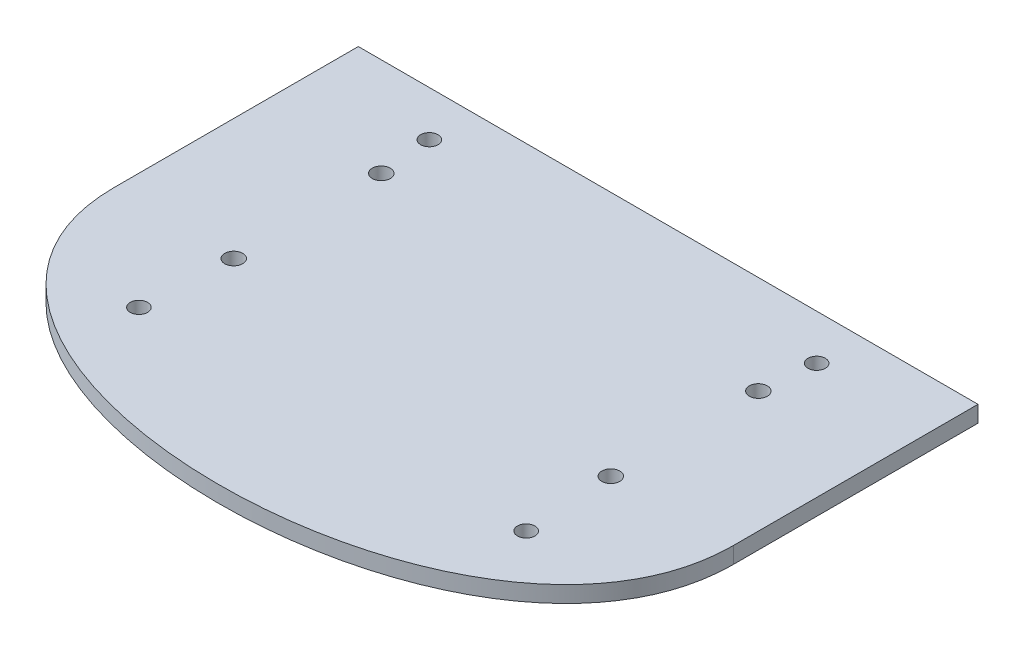
ISO-10303-21;
HEADER;
FILE_DESCRIPTION(('STEP AP214'),'2;1');
FILE_NAME('part.step','',(''),(''),'','','');
FILE_SCHEMA(('AUTOMOTIVE_DESIGN { 1 0 10303 214 1 1 1 1 }'));
ENDSEC;
DATA;
#1=APPLICATION_CONTEXT('core data for automotive mechanical design processes');
#2=APPLICATION_PROTOCOL_DEFINITION('international standard','automotive_design',2000,#1);
#3=PRODUCT_CONTEXT('',#1,'mechanical');
#4=PRODUCT('Part','Part','',(#3));
#5=PRODUCT_RELATED_PRODUCT_CATEGORY('part','',(#4));
#6=PRODUCT_DEFINITION_FORMATION('','',#4);
#7=PRODUCT_DEFINITION_CONTEXT('part definition',#1,'design');
#8=PRODUCT_DEFINITION('design','',#6,#7);
#9=PRODUCT_DEFINITION_SHAPE('','',#8);
#10=(LENGTH_UNIT() NAMED_UNIT(*) SI_UNIT(.MILLI.,.METRE.));
#11=(NAMED_UNIT(*) PLANE_ANGLE_UNIT() SI_UNIT($,.RADIAN.));
#12=(NAMED_UNIT(*) SI_UNIT($,.STERADIAN.) SOLID_ANGLE_UNIT());
#13=UNCERTAINTY_MEASURE_WITH_UNIT(LENGTH_MEASURE(1.E-05),#10,'distance_accuracy_value','');
#14=(GEOMETRIC_REPRESENTATION_CONTEXT(3) GLOBAL_UNCERTAINTY_ASSIGNED_CONTEXT((#13)) GLOBAL_UNIT_ASSIGNED_CONTEXT((#10,
#11,#12)) REPRESENTATION_CONTEXT('',''));
#15=CARTESIAN_POINT('',(0.,0.,0.));
#16=DIRECTION('',(0.,0.,1.));
#17=DIRECTION('',(1.,0.,0.));
#18=AXIS2_PLACEMENT_3D('',#15,#16,#17);
#19=CARTESIAN_POINT('',(-48.006,2.54,-34.798));
#20=DIRECTION('',(1.,0.,0.));
#21=DIRECTION('',(0.,0.,-1.));
#22=AXIS2_PLACEMENT_3D('',#19,#20,#21);
#23=PLANE('',#22);
#24=DIRECTION('',(0.,0.,1.));
#25=VECTOR('',#24,1.);
#26=CARTESIAN_POINT('',(-48.006,0.,-34.798));
#27=LINE('',#26,#25);
#28=CARTESIAN_POINT('',(-48.006,0.,-34.798));
#29=VERTEX_POINT('',#28);
#30=CARTESIAN_POINT('',(-48.006,0.,3.04800000000002));
#31=VERTEX_POINT('',#30);
#32=EDGE_CURVE('E98',#29,#31,#27,.T.);
#33=ORIENTED_EDGE('',*,*,#32,.T.);
#34=DIRECTION('',(0.,-1.,0.));
#35=VECTOR('',#34,1.);
#36=CARTESIAN_POINT('',(-48.006,2.54,3.04800000000002));
#37=LINE('',#36,#35);
#38=CARTESIAN_POINT('',(-48.006,2.54,3.04800000000002));
#39=VERTEX_POINT('',#38);
#40=EDGE_CURVE('E11',#39,#31,#37,.T.);
#41=ORIENTED_EDGE('',*,*,#40,.F.);
#42=DIRECTION('',(0.,0.,1.));
#43=VECTOR('',#42,1.);
#44=CARTESIAN_POINT('',(-48.006,2.54,-34.798));
#45=LINE('',#44,#43);
#46=CARTESIAN_POINT('',(-48.006,2.54,-34.798));
#47=VERTEX_POINT('',#46);
#48=EDGE_CURVE('E83',#47,#39,#45,.T.);
#49=ORIENTED_EDGE('',*,*,#48,.F.);
#50=DIRECTION('',(0.,-1.,0.));
#51=VECTOR('',#50,1.);
#52=CARTESIAN_POINT('',(-48.006,2.54,-34.798));
#53=LINE('',#52,#51);
#54=EDGE_CURVE('E91',#47,#29,#53,.T.);
#55=ORIENTED_EDGE('',*,*,#54,.T.);
#56=EDGE_LOOP('',(#33,#41,#49,#55));
#57=FACE_BOUND('',#56,.T.);
#58=ADVANCED_FACE('F32',(#57),#23,.F.);
#59=CARTESIAN_POINT('',(-48.006,2.54,3.04800000000002));
#60=CARTESIAN_POINT('',(-48.006,2.54,45.3813333333333));
#61=CARTESIAN_POINT('',(48.0060000000003,2.54,45.3813333333333));
#62=CARTESIAN_POINT('',(48.006,2.54,3.04800000000002));
#63=B_SPLINE_CURVE_WITH_KNOTS('',3,(#59,#60,#61,#62),.UNSPECIFIED.,.F.,.F.,(4,4),(0.,1.),.UNSPECIFIED.);
#64=DIRECTION('',(0.,-1.,0.));
#65=VECTOR('',#64,1.);
#66=SURFACE_OF_LINEAR_EXTRUSION('',#63,#65);
#67=CARTESIAN_POINT('',(-48.006,0.,3.04800000000002));
#68=CARTESIAN_POINT('',(-48.006,0.,45.3813333333333));
#69=CARTESIAN_POINT('',(48.0060000000003,0.,45.3813333333333));
#70=CARTESIAN_POINT('',(48.006,0.,3.04800000000002));
#71=B_SPLINE_CURVE_WITH_KNOTS('',3,(#67,#68,#69,#70),.UNSPECIFIED.,.F.,.F.,(4,4),(0.,1.),.UNSPECIFIED.);
#72=CARTESIAN_POINT('',(48.006,0.,3.04800000000001));
#73=VERTEX_POINT('',#72);
#74=EDGE_CURVE('E87',#31,#73,#71,.T.);
#75=ORIENTED_EDGE('',*,*,#74,.T.);
#76=DIRECTION('',(0.,-1.,0.));
#77=VECTOR('',#76,1.);
#78=CARTESIAN_POINT('',(48.006,2.54,3.04800000000001));
#79=LINE('',#78,#77);
#80=CARTESIAN_POINT('',(48.006,2.54,3.04800000000001));
#81=VERTEX_POINT('',#80);
#82=EDGE_CURVE('E40',#81,#73,#79,.T.);
#83=ORIENTED_EDGE('',*,*,#82,.F.);
#84=EDGE_CURVE('E78',#39,#81,#63,.T.);
#85=ORIENTED_EDGE('',*,*,#84,.F.);
#86=ORIENTED_EDGE('',*,*,#40,.T.);
#87=EDGE_LOOP('',(#75,#83,#85,#86));
#88=FACE_BOUND('',#87,.T.);
#89=ADVANCED_FACE('F86',(#88),#66,.F.);
#90=CARTESIAN_POINT('',(48.006,2.54,-34.798));
#91=DIRECTION('',(-1.,0.,0.));
#92=DIRECTION('',(0.,0.,1.));
#93=AXIS2_PLACEMENT_3D('',#90,#91,#92);
#94=PLANE('',#93);
#95=DIRECTION('',(0.,0.,-1.));
#96=VECTOR('',#95,1.);
#97=CARTESIAN_POINT('',(48.006,0.,-34.798));
#98=LINE('',#97,#96);
#99=CARTESIAN_POINT('',(48.006,0.,-34.798));
#100=VERTEX_POINT('',#99);
#101=EDGE_CURVE('E65',#73,#100,#98,.T.);
#102=ORIENTED_EDGE('',*,*,#101,.T.);
#103=DIRECTION('',(0.,-1.,0.));
#104=VECTOR('',#103,1.);
#105=CARTESIAN_POINT('',(48.006,2.54,-34.798));
#106=LINE('',#105,#104);
#107=CARTESIAN_POINT('',(48.006,2.54,-34.798));
#108=VERTEX_POINT('',#107);
#109=EDGE_CURVE('E88',#108,#100,#106,.T.);
#110=ORIENTED_EDGE('',*,*,#109,.F.);
#111=DIRECTION('',(0.,0.,-1.));
#112=VECTOR('',#111,1.);
#113=CARTESIAN_POINT('',(48.006,2.54,-34.798));
#114=LINE('',#113,#112);
#115=EDGE_CURVE('E81',#81,#108,#114,.T.);
#116=ORIENTED_EDGE('',*,*,#115,.F.);
#117=ORIENTED_EDGE('',*,*,#82,.T.);
#118=EDGE_LOOP('',(#102,#110,#116,#117));
#119=FACE_BOUND('',#118,.T.);
#120=ADVANCED_FACE('F89',(#119),#94,.F.);
#121=CARTESIAN_POINT('',(48.006,2.54,-34.798));
#122=DIRECTION('',(0.,0.,1.));
#123=DIRECTION('',(1.,0.,0.));
#124=AXIS2_PLACEMENT_3D('',#121,#122,#123);
#125=PLANE('',#124);
#126=DIRECTION('',(-1.,0.,0.));
#127=VECTOR('',#126,1.);
#128=CARTESIAN_POINT('',(48.006,0.,-34.798));
#129=LINE('',#128,#127);
#130=EDGE_CURVE('E71',#100,#29,#129,.T.);
#131=ORIENTED_EDGE('',*,*,#130,.T.);
#132=ORIENTED_EDGE('',*,*,#54,.F.);
#133=DIRECTION('',(-1.,0.,0.));
#134=VECTOR('',#133,1.);
#135=CARTESIAN_POINT('',(48.006,2.54,-34.798));
#136=LINE('',#135,#134);
#137=EDGE_CURVE('E48',#108,#47,#136,.T.);
#138=ORIENTED_EDGE('',*,*,#137,.F.);
#139=ORIENTED_EDGE('',*,*,#109,.T.);
#140=EDGE_LOOP('',(#131,#132,#138,#139));
#141=FACE_BOUND('',#140,.T.);
#142=ADVANCED_FACE('F111',(#141),#125,.F.);
#143=CARTESIAN_POINT('',(1.21430643318376E-13,2.54,34.798));
#144=DIRECTION('',(0.,-1.,0.));
#145=DIRECTION('',(0.,0.,-1.));
#146=AXIS2_PLACEMENT_3D('',#143,#144,#145);
#147=PLANE('',#146);
#148=CARTESIAN_POINT('',(-29.21,2.54,3.30199999999999));
#149=DIRECTION('',(0.,-1.,0.));
#150=DIRECTION('',(0.,0.,-1.));
#151=AXIS2_PLACEMENT_3D('',#148,#149,#150);
#152=CIRCLE('',#151,1.397);
#153=CARTESIAN_POINT('',(-29.21,2.54,1.90499999999999));
#154=VERTEX_POINT('',#153);
#155=EDGE_CURVE('E101',#154,#154,#152,.T.);
#156=ORIENTED_EDGE('',*,*,#155,.T.);
#157=EDGE_LOOP('',(#156));
#158=FACE_BOUND('',#157,.T.);
#159=CARTESIAN_POINT('',(29.21,2.54,3.30199999999999));
#160=DIRECTION('',(0.,-1.,0.));
#161=DIRECTION('',(0.,0.,-1.));
#162=AXIS2_PLACEMENT_3D('',#159,#160,#161);
#163=CIRCLE('',#162,1.397);
#164=CARTESIAN_POINT('',(29.21,2.54,1.90499999999999));
#165=VERTEX_POINT('',#164);
#166=EDGE_CURVE('E119',#165,#165,#163,.T.);
#167=ORIENTED_EDGE('',*,*,#166,.T.);
#168=EDGE_LOOP('',(#167));
#169=FACE_BOUND('',#168,.T.);
#170=CARTESIAN_POINT('',(29.21,2.54,-19.558));
#171=DIRECTION('',(0.,-1.,0.));
#172=DIRECTION('',(0.,0.,-1.));
#173=AXIS2_PLACEMENT_3D('',#170,#171,#172);
#174=CIRCLE('',#173,1.397);
#175=CARTESIAN_POINT('',(29.21,2.54,-20.955));
#176=VERTEX_POINT('',#175);
#177=EDGE_CURVE('E122',#176,#176,#174,.T.);
#178=ORIENTED_EDGE('',*,*,#177,.T.);
#179=EDGE_LOOP('',(#178));
#180=FACE_BOUND('',#179,.T.);
#181=CARTESIAN_POINT('',(-30.,2.54,-27.798));
#182=DIRECTION('',(0.,-1.,0.));
#183=DIRECTION('',(0.,0.,-1.));
#184=AXIS2_PLACEMENT_3D('',#181,#182,#183);
#185=CIRCLE('',#184,1.35);
#186=CARTESIAN_POINT('',(-30.,2.54,-29.148));
#187=VERTEX_POINT('',#186);
#188=EDGE_CURVE('E125',#187,#187,#185,.T.);
#189=ORIENTED_EDGE('',*,*,#188,.T.);
#190=EDGE_LOOP('',(#189));
#191=FACE_BOUND('',#190,.T.);
#192=CARTESIAN_POINT('',(-30.,2.54,17.202));
#193=DIRECTION('',(0.,-1.,0.));
#194=DIRECTION('',(0.,0.,-1.));
#195=AXIS2_PLACEMENT_3D('',#192,#193,#194);
#196=CIRCLE('',#195,1.35000000000001);
#197=CARTESIAN_POINT('',(-30.,2.54,15.852));
#198=VERTEX_POINT('',#197);
#199=EDGE_CURVE('E128',#198,#198,#196,.T.);
#200=ORIENTED_EDGE('',*,*,#199,.T.);
#201=EDGE_LOOP('',(#200));
#202=FACE_BOUND('',#201,.T.);
#203=CARTESIAN_POINT('',(30.,2.54,17.202));
#204=DIRECTION('',(0.,-1.,0.));
#205=DIRECTION('',(0.,0.,-1.));
#206=AXIS2_PLACEMENT_3D('',#203,#204,#205);
#207=CIRCLE('',#206,1.35000000000001);
#208=CARTESIAN_POINT('',(30.,2.54,15.852));
#209=VERTEX_POINT('',#208);
#210=EDGE_CURVE('E131',#209,#209,#207,.T.);
#211=ORIENTED_EDGE('',*,*,#210,.T.);
#212=EDGE_LOOP('',(#211));
#213=FACE_BOUND('',#212,.T.);
#214=CARTESIAN_POINT('',(30.,2.54,-27.798));
#215=DIRECTION('',(0.,-1.,0.));
#216=DIRECTION('',(0.,0.,-1.));
#217=AXIS2_PLACEMENT_3D('',#214,#215,#216);
#218=CIRCLE('',#217,1.35);
#219=CARTESIAN_POINT('',(30.,2.54,-29.148));
#220=VERTEX_POINT('',#219);
#221=EDGE_CURVE('E134',#220,#220,#218,.T.);
#222=ORIENTED_EDGE('',*,*,#221,.T.);
#223=EDGE_LOOP('',(#222));
#224=FACE_BOUND('',#223,.T.);
#225=CARTESIAN_POINT('',(-29.21,2.54,-19.558));
#226=DIRECTION('',(0.,-1.,0.));
#227=DIRECTION('',(0.,0.,-1.));
#228=AXIS2_PLACEMENT_3D('',#225,#226,#227);
#229=CIRCLE('',#228,1.397);
#230=CARTESIAN_POINT('',(-29.21,2.54,-20.955));
#231=VERTEX_POINT('',#230);
#232=EDGE_CURVE('E137',#231,#231,#229,.T.);
#233=ORIENTED_EDGE('',*,*,#232,.T.);
#234=EDGE_LOOP('',(#233));
#235=FACE_BOUND('',#234,.T.);
#236=ORIENTED_EDGE('',*,*,#48,.T.);
#237=ORIENTED_EDGE('',*,*,#84,.T.);
#238=ORIENTED_EDGE('',*,*,#115,.T.);
#239=ORIENTED_EDGE('',*,*,#137,.T.);
#240=EDGE_LOOP('',(#236,#237,#238,#239));
#241=FACE_BOUND('',#240,.T.);
#242=ADVANCED_FACE('F79',(#158,#169,#180,#191,#202,#213,#224,#235,#241),#147,.F.);
#243=CARTESIAN_POINT('',(1.21430643318376E-13,0.,34.798));
#244=DIRECTION('',(0.,-1.,0.));
#245=DIRECTION('',(0.,0.,-1.));
#246=AXIS2_PLACEMENT_3D('',#243,#244,#245);
#247=PLANE('',#246);
#248=CARTESIAN_POINT('',(-29.21,0.,3.30199999999999));
#249=DIRECTION('',(0.,1.,0.));
#250=DIRECTION('',(0.,0.,1.));
#251=AXIS2_PLACEMENT_3D('',#248,#249,#250);
#252=CIRCLE('',#251,1.397);
#253=CARTESIAN_POINT('',(-29.21,0.,4.69899999999999));
#254=VERTEX_POINT('',#253);
#255=EDGE_CURVE('E143',#254,#254,#252,.T.);
#256=ORIENTED_EDGE('',*,*,#255,.T.);
#257=EDGE_LOOP('',(#256));
#258=FACE_BOUND('',#257,.T.);
#259=CARTESIAN_POINT('',(29.21,0.,3.30199999999999));
#260=DIRECTION('',(0.,1.,0.));
#261=DIRECTION('',(0.,0.,-1.));
#262=AXIS2_PLACEMENT_3D('',#259,#260,#261);
#263=CIRCLE('',#262,1.397);
#264=CARTESIAN_POINT('',(29.21,0.,1.90499999999999));
#265=VERTEX_POINT('',#264);
#266=EDGE_CURVE('E151',#265,#265,#263,.T.);
#267=ORIENTED_EDGE('',*,*,#266,.T.);
#268=EDGE_LOOP('',(#267));
#269=FACE_BOUND('',#268,.T.);
#270=CARTESIAN_POINT('',(29.21,0.,-19.558));
#271=DIRECTION('',(0.,1.,0.));
#272=DIRECTION('',(0.,0.,-1.));
#273=AXIS2_PLACEMENT_3D('',#270,#271,#272);
#274=CIRCLE('',#273,1.397);
#275=CARTESIAN_POINT('',(29.21,0.,-20.955));
#276=VERTEX_POINT('',#275);
#277=EDGE_CURVE('E147',#276,#276,#274,.T.);
#278=ORIENTED_EDGE('',*,*,#277,.T.);
#279=EDGE_LOOP('',(#278));
#280=FACE_BOUND('',#279,.T.);
#281=CARTESIAN_POINT('',(-30.,0.,-27.798));
#282=DIRECTION('',(0.,1.,0.));
#283=DIRECTION('',(0.,0.,1.));
#284=AXIS2_PLACEMENT_3D('',#281,#282,#283);
#285=CIRCLE('',#284,1.35);
#286=CARTESIAN_POINT('',(-30.,0.,-26.448));
#287=VERTEX_POINT('',#286);
#288=EDGE_CURVE('E144',#287,#287,#285,.T.);
#289=ORIENTED_EDGE('',*,*,#288,.T.);
#290=EDGE_LOOP('',(#289));
#291=FACE_BOUND('',#290,.T.);
#292=CARTESIAN_POINT('',(-30.,0.,17.202));
#293=DIRECTION('',(0.,1.,0.));
#294=DIRECTION('',(0.,0.,1.));
#295=AXIS2_PLACEMENT_3D('',#292,#293,#294);
#296=CIRCLE('',#295,1.35000000000001);
#297=CARTESIAN_POINT('',(-30.,0.,18.552));
#298=VERTEX_POINT('',#297);
#299=EDGE_CURVE('E148',#298,#298,#296,.T.);
#300=ORIENTED_EDGE('',*,*,#299,.T.);
#301=EDGE_LOOP('',(#300));
#302=FACE_BOUND('',#301,.T.);
#303=CARTESIAN_POINT('',(30.,0.,17.202));
#304=DIRECTION('',(0.,1.,0.));
#305=DIRECTION('',(0.,0.,-1.));
#306=AXIS2_PLACEMENT_3D('',#303,#304,#305);
#307=CIRCLE('',#306,1.35000000000001);
#308=CARTESIAN_POINT('',(30.,0.,15.852));
#309=VERTEX_POINT('',#308);
#310=EDGE_CURVE('E159',#309,#309,#307,.T.);
#311=ORIENTED_EDGE('',*,*,#310,.T.);
#312=EDGE_LOOP('',(#311));
#313=FACE_BOUND('',#312,.T.);
#314=CARTESIAN_POINT('',(30.,0.,-27.798));
#315=DIRECTION('',(0.,1.,0.));
#316=DIRECTION('',(0.,0.,-1.));
#317=AXIS2_PLACEMENT_3D('',#314,#315,#316);
#318=CIRCLE('',#317,1.35);
#319=CARTESIAN_POINT('',(30.,0.,-29.148));
#320=VERTEX_POINT('',#319);
#321=EDGE_CURVE('E156',#320,#320,#318,.T.);
#322=ORIENTED_EDGE('',*,*,#321,.T.);
#323=EDGE_LOOP('',(#322));
#324=FACE_BOUND('',#323,.T.);
#325=CARTESIAN_POINT('',(-29.21,0.,-19.558));
#326=DIRECTION('',(0.,1.,0.));
#327=DIRECTION('',(0.,0.,1.));
#328=AXIS2_PLACEMENT_3D('',#325,#326,#327);
#329=CIRCLE('',#328,1.397);
#330=CARTESIAN_POINT('',(-29.21,0.,-18.161));
#331=VERTEX_POINT('',#330);
#332=EDGE_CURVE('E140',#331,#331,#329,.T.);
#333=ORIENTED_EDGE('',*,*,#332,.T.);
#334=EDGE_LOOP('',(#333));
#335=FACE_BOUND('',#334,.T.);
#336=ORIENTED_EDGE('',*,*,#32,.F.);
#337=ORIENTED_EDGE('',*,*,#130,.F.);
#338=ORIENTED_EDGE('',*,*,#101,.F.);
#339=ORIENTED_EDGE('',*,*,#74,.F.);
#340=EDGE_LOOP('',(#336,#337,#338,#339));
#341=FACE_BOUND('',#340,.T.);
#342=ADVANCED_FACE('F114',(#258,#269,#280,#291,#302,#313,#324,#335,#341),#247,.T.);
#343=CARTESIAN_POINT('',(-29.21,0.,-19.558));
#344=DIRECTION('',(0.,1.,0.));
#345=DIRECTION('',(0.,0.,1.));
#346=AXIS2_PLACEMENT_3D('',#343,#344,#345);
#347=CYLINDRICAL_SURFACE('',#346,1.397);
#348=ORIENTED_EDGE('',*,*,#332,.F.);
#349=EDGE_LOOP('',(#348));
#350=FACE_BOUND('',#349,.T.);
#351=ORIENTED_EDGE('',*,*,#232,.F.);
#352=EDGE_LOOP('',(#351));
#353=FACE_BOUND('',#352,.T.);
#354=ADVANCED_FACE('F185',(#350,#353),#347,.F.);
#355=CARTESIAN_POINT('',(30.,0.,-27.798));
#356=DIRECTION('',(0.,1.,0.));
#357=DIRECTION('',(0.,0.,1.));
#358=AXIS2_PLACEMENT_3D('',#355,#356,#357);
#359=CYLINDRICAL_SURFACE('',#358,1.35);
#360=ORIENTED_EDGE('',*,*,#321,.F.);
#361=EDGE_LOOP('',(#360));
#362=FACE_BOUND('',#361,.T.);
#363=ORIENTED_EDGE('',*,*,#221,.F.);
#364=EDGE_LOOP('',(#363));
#365=FACE_BOUND('',#364,.T.);
#366=ADVANCED_FACE('F187',(#362,#365),#359,.F.);
#367=CARTESIAN_POINT('',(30.,0.,17.202));
#368=DIRECTION('',(0.,1.,0.));
#369=DIRECTION('',(0.,0.,1.));
#370=AXIS2_PLACEMENT_3D('',#367,#368,#369);
#371=CYLINDRICAL_SURFACE('',#370,1.35000000000001);
#372=ORIENTED_EDGE('',*,*,#310,.F.);
#373=EDGE_LOOP('',(#372));
#374=FACE_BOUND('',#373,.T.);
#375=ORIENTED_EDGE('',*,*,#210,.F.);
#376=EDGE_LOOP('',(#375));
#377=FACE_BOUND('',#376,.T.);
#378=ADVANCED_FACE('F171',(#374,#377),#371,.F.);
#379=CARTESIAN_POINT('',(-30.,0.,17.202));
#380=DIRECTION('',(0.,1.,0.));
#381=DIRECTION('',(0.,0.,1.));
#382=AXIS2_PLACEMENT_3D('',#379,#380,#381);
#383=CYLINDRICAL_SURFACE('',#382,1.35000000000001);
#384=ORIENTED_EDGE('',*,*,#299,.F.);
#385=EDGE_LOOP('',(#384));
#386=FACE_BOUND('',#385,.T.);
#387=ORIENTED_EDGE('',*,*,#199,.F.);
#388=EDGE_LOOP('',(#387));
#389=FACE_BOUND('',#388,.T.);
#390=ADVANCED_FACE('F167',(#386,#389),#383,.F.);
#391=CARTESIAN_POINT('',(-30.,0.,-27.798));
#392=DIRECTION('',(0.,1.,0.));
#393=DIRECTION('',(0.,0.,1.));
#394=AXIS2_PLACEMENT_3D('',#391,#392,#393);
#395=CYLINDRICAL_SURFACE('',#394,1.35);
#396=ORIENTED_EDGE('',*,*,#288,.F.);
#397=EDGE_LOOP('',(#396));
#398=FACE_BOUND('',#397,.T.);
#399=ORIENTED_EDGE('',*,*,#188,.F.);
#400=EDGE_LOOP('',(#399));
#401=FACE_BOUND('',#400,.T.);
#402=ADVANCED_FACE('F170',(#398,#401),#395,.F.);
#403=CARTESIAN_POINT('',(29.21,0.,-19.558));
#404=DIRECTION('',(0.,1.,0.));
#405=DIRECTION('',(0.,0.,1.));
#406=AXIS2_PLACEMENT_3D('',#403,#404,#405);
#407=CYLINDRICAL_SURFACE('',#406,1.397);
#408=ORIENTED_EDGE('',*,*,#277,.F.);
#409=EDGE_LOOP('',(#408));
#410=FACE_BOUND('',#409,.T.);
#411=ORIENTED_EDGE('',*,*,#177,.F.);
#412=EDGE_LOOP('',(#411));
#413=FACE_BOUND('',#412,.T.);
#414=ADVANCED_FACE('F256',(#410,#413),#407,.F.);
#415=CARTESIAN_POINT('',(29.21,0.,3.30199999999999));
#416=DIRECTION('',(0.,1.,0.));
#417=DIRECTION('',(0.,0.,1.));
#418=AXIS2_PLACEMENT_3D('',#415,#416,#417);
#419=CYLINDRICAL_SURFACE('',#418,1.397);
#420=ORIENTED_EDGE('',*,*,#266,.F.);
#421=EDGE_LOOP('',(#420));
#422=FACE_BOUND('',#421,.T.);
#423=ORIENTED_EDGE('',*,*,#166,.F.);
#424=EDGE_LOOP('',(#423));
#425=FACE_BOUND('',#424,.T.);
#426=ADVANCED_FACE('F265',(#422,#425),#419,.F.);
#427=CARTESIAN_POINT('',(-29.21,0.,3.30199999999999));
#428=DIRECTION('',(0.,1.,0.));
#429=DIRECTION('',(0.,0.,1.));
#430=AXIS2_PLACEMENT_3D('',#427,#428,#429);
#431=CYLINDRICAL_SURFACE('',#430,1.397);
#432=ORIENTED_EDGE('',*,*,#255,.F.);
#433=EDGE_LOOP('',(#432));
#434=FACE_BOUND('',#433,.T.);
#435=ORIENTED_EDGE('',*,*,#155,.F.);
#436=EDGE_LOOP('',(#435));
#437=FACE_BOUND('',#436,.T.);
#438=ADVANCED_FACE('F275',(#434,#437),#431,.F.);
#439=CLOSED_SHELL('',(#58,#89,#120,#142,#242,#342,#354,#366,#378,#390,#402,#414,#426,#438));
#440=MANIFOLD_SOLID_BREP('B2',#439);
#441=ADVANCED_BREP_SHAPE_REPRESENTATION('',(#18,#440),#14);
#442=SHAPE_DEFINITION_REPRESENTATION(#9,#441);
ENDSEC;
END-ISO-10303-21;
